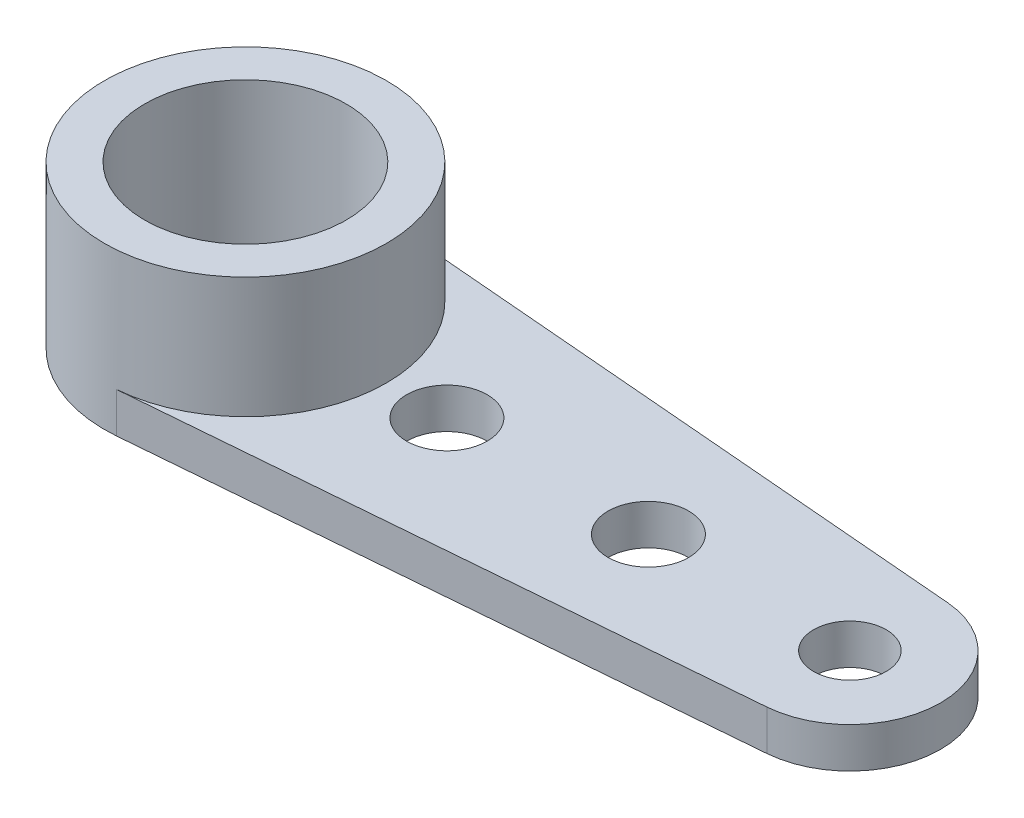
ISO-10303-21;
HEADER;
FILE_DESCRIPTION(('STEP AP214'),'2;1');
FILE_NAME('part.step','',(''),(''),'','','');
FILE_SCHEMA(('AUTOMOTIVE_DESIGN { 1 0 10303 214 1 1 1 1 }'));
ENDSEC;
DATA;
#1=APPLICATION_CONTEXT('core data for automotive mechanical design processes');
#2=APPLICATION_PROTOCOL_DEFINITION('international standard','automotive_design',2000,#1);
#3=PRODUCT_CONTEXT('',#1,'mechanical');
#4=PRODUCT('Part','Part','',(#3));
#5=PRODUCT_RELATED_PRODUCT_CATEGORY('part','',(#4));
#6=PRODUCT_DEFINITION_FORMATION('','',#4);
#7=PRODUCT_DEFINITION_CONTEXT('part definition',#1,'design');
#8=PRODUCT_DEFINITION('design','',#6,#7);
#9=PRODUCT_DEFINITION_SHAPE('','',#8);
#10=(LENGTH_UNIT() NAMED_UNIT(*) SI_UNIT(.MILLI.,.METRE.));
#11=(NAMED_UNIT(*) PLANE_ANGLE_UNIT() SI_UNIT($,.RADIAN.));
#12=(NAMED_UNIT(*) SI_UNIT($,.STERADIAN.) SOLID_ANGLE_UNIT());
#13=UNCERTAINTY_MEASURE_WITH_UNIT(LENGTH_MEASURE(1.E-05),#10,'distance_accuracy_value','');
#14=(GEOMETRIC_REPRESENTATION_CONTEXT(3) GLOBAL_UNCERTAINTY_ASSIGNED_CONTEXT((#13)) GLOBAL_UNIT_ASSIGNED_CONTEXT((#10,
#11,#12)) REPRESENTATION_CONTEXT('',''));
#15=CARTESIAN_POINT('',(0.,0.,0.));
#16=DIRECTION('',(0.,0.,1.));
#17=DIRECTION('',(1.,0.,0.));
#18=AXIS2_PLACEMENT_3D('',#15,#16,#17);
#19=CARTESIAN_POINT('',(0.291666666666666,1.,3.48782605007124));
#20=DIRECTION('',(-0.0833333333333333,0.,-0.996521728591783));
#21=DIRECTION('',(-0.996521728591783,0.,0.0833333333333333));
#22=AXIS2_PLACEMENT_3D('',#19,#20,#21);
#23=PLANE('',#22);
#24=DIRECTION('',(0.996521728591783,0.,-0.0833333333333333));
#25=VECTOR('',#24,1.);
#26=CARTESIAN_POINT('',(0.291666666666666,0.,3.48782605007124));
#27=LINE('',#26,#25);
#28=CARTESIAN_POINT('',(0.291666666666667,0.,3.48782605007124));
#29=VERTEX_POINT('',#28);
#30=CARTESIAN_POINT('',(15.1875,0.,2.24217388933151));
#31=VERTEX_POINT('',#30);
#32=EDGE_CURVE('E109',#29,#31,#27,.T.);
#33=ORIENTED_EDGE('',*,*,#32,.T.);
#34=DIRECTION('',(0.,-1.,0.));
#35=VECTOR('',#34,1.);
#36=CARTESIAN_POINT('',(15.1875,1.,2.24217388933151));
#37=LINE('',#36,#35);
#38=CARTESIAN_POINT('',(15.1875,1.,2.24217388933151));
#39=VERTEX_POINT('',#38);
#40=EDGE_CURVE('E11',#39,#31,#37,.T.);
#41=ORIENTED_EDGE('',*,*,#40,.F.);
#42=DIRECTION('',(0.996521728591783,0.,-0.0833333333333333));
#43=VECTOR('',#42,1.);
#44=CARTESIAN_POINT('',(0.291666666666666,1.,3.48782605007124));
#45=LINE('',#44,#43);
#46=CARTESIAN_POINT('',(0.291666666666667,1.,3.48782605007124));
#47=VERTEX_POINT('',#46);
#48=EDGE_CURVE('E92',#47,#39,#45,.T.);
#49=ORIENTED_EDGE('',*,*,#48,.F.);
#50=DIRECTION('',(0.,-1.,0.));
#51=VECTOR('',#50,1.);
#52=CARTESIAN_POINT('',(0.291666666666667,1.,3.48782605007124));
#53=LINE('',#52,#51);
#54=EDGE_CURVE('E94',#47,#29,#53,.T.);
#55=ORIENTED_EDGE('',*,*,#54,.T.);
#56=EDGE_LOOP('',(#33,#41,#49,#55));
#57=FACE_BOUND('',#56,.T.);
#58=ADVANCED_FACE('F46',(#57),#23,.F.);
#59=CARTESIAN_POINT('',(15.,1.,0.));
#60=DIRECTION('',(0.,-1.,0.));
#61=DIRECTION('',(0.,0.,-1.));
#62=AXIS2_PLACEMENT_3D('',#59,#60,#61);
#63=CYLINDRICAL_SURFACE('',#62,2.25);
#64=CARTESIAN_POINT('',(15.,0.,0.));
#65=DIRECTION('',(0.,1.,0.));
#66=DIRECTION('',(0.,0.,1.));
#67=AXIS2_PLACEMENT_3D('',#64,#65,#66);
#68=CIRCLE('',#67,2.25);
#69=CARTESIAN_POINT('',(15.1875,0.,-2.24217388933151));
#70=VERTEX_POINT('',#69);
#71=EDGE_CURVE('E119',#31,#70,#68,.T.);
#72=ORIENTED_EDGE('',*,*,#71,.T.);
#73=DIRECTION('',(0.,-1.,0.));
#74=VECTOR('',#73,1.);
#75=CARTESIAN_POINT('',(15.1875,1.,-2.24217388933151));
#76=LINE('',#75,#74);
#77=CARTESIAN_POINT('',(15.1875,1.,-2.24217388933151));
#78=VERTEX_POINT('',#77);
#79=EDGE_CURVE('E54',#78,#70,#76,.T.);
#80=ORIENTED_EDGE('',*,*,#79,.F.);
#81=CARTESIAN_POINT('',(15.,1.,0.));
#82=DIRECTION('',(0.,1.,0.));
#83=DIRECTION('',(0.,0.,1.));
#84=AXIS2_PLACEMENT_3D('',#81,#82,#83);
#85=CIRCLE('',#84,2.25);
#86=EDGE_CURVE('E86',#39,#78,#85,.T.);
#87=ORIENTED_EDGE('',*,*,#86,.F.);
#88=ORIENTED_EDGE('',*,*,#40,.T.);
#89=EDGE_LOOP('',(#72,#80,#87,#88));
#90=FACE_BOUND('',#89,.T.);
#91=ADVANCED_FACE('F127',(#90),#63,.T.);
#92=CARTESIAN_POINT('',(0.291666666666667,1.,-3.48782605007124));
#93=DIRECTION('',(0.0833333333333333,0.,-0.996521728591783));
#94=DIRECTION('',(-0.996521728591783,0.,-0.0833333333333333));
#95=AXIS2_PLACEMENT_3D('',#92,#93,#94);
#96=PLANE('',#95);
#97=DIRECTION('',(0.996521728591783,0.,0.0833333333333333));
#98=VECTOR('',#97,1.);
#99=CARTESIAN_POINT('',(0.291666666666667,0.,-3.48782605007124));
#100=LINE('',#99,#98);
#101=CARTESIAN_POINT('',(0.291666666666667,0.,-3.48782605007124));
#102=VERTEX_POINT('',#101);
#103=EDGE_CURVE('E122',#102,#70,#100,.T.);
#104=ORIENTED_EDGE('',*,*,#103,.F.);
#105=DIRECTION('',(0.,-1.,0.));
#106=VECTOR('',#105,1.);
#107=CARTESIAN_POINT('',(0.291666666666667,1.,-3.48782605007124));
#108=LINE('',#107,#106);
#109=CARTESIAN_POINT('',(0.291666666666667,1.,-3.48782605007124));
#110=VERTEX_POINT('',#109);
#111=EDGE_CURVE('E62',#110,#102,#108,.T.);
#112=ORIENTED_EDGE('',*,*,#111,.F.);
#113=DIRECTION('',(0.996521728591783,0.,0.0833333333333333));
#114=VECTOR('',#113,1.);
#115=CARTESIAN_POINT('',(0.291666666666667,1.,-3.48782605007124));
#116=LINE('',#115,#114);
#117=EDGE_CURVE('E102',#110,#78,#116,.T.);
#118=ORIENTED_EDGE('',*,*,#117,.T.);
#119=ORIENTED_EDGE('',*,*,#79,.T.);
#120=EDGE_LOOP('',(#104,#112,#118,#119));
#121=FACE_BOUND('',#120,.T.);
#122=ADVANCED_FACE('F126',(#121),#96,.T.);
#123=CARTESIAN_POINT('',(0.,1.,0.));
#124=DIRECTION('',(0.,-1.,0.));
#125=DIRECTION('',(0.,0.,-1.));
#126=AXIS2_PLACEMENT_3D('',#123,#124,#125);
#127=CYLINDRICAL_SURFACE('',#126,3.5);
#128=CARTESIAN_POINT('',(0.,0.,0.));
#129=DIRECTION('',(0.,1.,0.));
#130=DIRECTION('',(0.,0.,1.));
#131=AXIS2_PLACEMENT_3D('',#128,#129,#130);
#132=CIRCLE('',#131,3.5);
#133=EDGE_CURVE('E81',#102,#29,#132,.T.);
#134=ORIENTED_EDGE('',*,*,#133,.T.);
#135=ORIENTED_EDGE('',*,*,#54,.F.);
#136=CARTESIAN_POINT('',(0.,1.,0.));
#137=DIRECTION('',(0.,1.,0.));
#138=DIRECTION('',(0.,0.,1.));
#139=AXIS2_PLACEMENT_3D('',#136,#137,#138);
#140=CIRCLE('',#139,3.5);
#141=EDGE_CURVE('E101',#47,#110,#140,.T.);
#142=ORIENTED_EDGE('',*,*,#141,.T.);
#143=ORIENTED_EDGE('',*,*,#111,.T.);
#144=EDGE_LOOP('',(#134,#135,#142,#143));
#145=FACE_BOUND('',#144,.T.);
#146=CARTESIAN_POINT('',(0.,4.,0.));
#147=DIRECTION('',(0.,1.,0.));
#148=DIRECTION('',(0.,0.,1.));
#149=AXIS2_PLACEMENT_3D('',#146,#147,#148);
#150=CIRCLE('',#149,3.5);
#151=CARTESIAN_POINT('',(0.,4.,3.5));
#152=VERTEX_POINT('',#151);
#153=EDGE_CURVE('E105',#152,#152,#150,.T.);
#154=ORIENTED_EDGE('',*,*,#153,.F.);
#155=EDGE_LOOP('',(#154));
#156=FACE_BOUND('',#155,.T.);
#157=ADVANCED_FACE('F99',(#145,#156),#127,.T.);
#158=CARTESIAN_POINT('',(0.,1.,0.));
#159=DIRECTION('',(0.,1.,0.));
#160=DIRECTION('',(0.,0.,1.));
#161=AXIS2_PLACEMENT_3D('',#158,#159,#160);
#162=PLANE('',#161);
#163=CARTESIAN_POINT('',(5.,1.,0.));
#164=DIRECTION('',(0.,1.,0.));
#165=DIRECTION('',(0.,0.,1.));
#166=AXIS2_PLACEMENT_3D('',#163,#164,#165);
#167=CIRCLE('',#166,1.);
#168=CARTESIAN_POINT('',(5.,1.,1.));
#169=VERTEX_POINT('',#168);
#170=EDGE_CURVE('E226',#169,#169,#167,.T.);
#171=ORIENTED_EDGE('',*,*,#170,.F.);
#172=EDGE_LOOP('',(#171));
#173=FACE_BOUND('',#172,.T.);
#174=CARTESIAN_POINT('',(10.,1.,0.));
#175=DIRECTION('',(0.,1.,0.));
#176=DIRECTION('',(0.,0.,1.));
#177=AXIS2_PLACEMENT_3D('',#174,#175,#176);
#178=CIRCLE('',#177,1.);
#179=CARTESIAN_POINT('',(10.,1.,1.));
#180=VERTEX_POINT('',#179);
#181=EDGE_CURVE('E229',#180,#180,#178,.T.);
#182=ORIENTED_EDGE('',*,*,#181,.F.);
#183=EDGE_LOOP('',(#182));
#184=FACE_BOUND('',#183,.T.);
#185=CARTESIAN_POINT('',(15.,1.,0.));
#186=DIRECTION('',(0.,1.,0.));
#187=DIRECTION('',(0.,0.,1.));
#188=AXIS2_PLACEMENT_3D('',#185,#186,#187);
#189=CIRCLE('',#188,0.9);
#190=CARTESIAN_POINT('',(15.,1.,0.9));
#191=VERTEX_POINT('',#190);
#192=EDGE_CURVE('E241',#191,#191,#189,.T.);
#193=ORIENTED_EDGE('',*,*,#192,.F.);
#194=EDGE_LOOP('',(#193));
#195=FACE_BOUND('',#194,.T.);
#196=ORIENTED_EDGE('',*,*,#141,.F.);
#197=ORIENTED_EDGE('',*,*,#48,.T.);
#198=ORIENTED_EDGE('',*,*,#86,.T.);
#199=ORIENTED_EDGE('',*,*,#117,.F.);
#200=EDGE_LOOP('',(#196,#197,#198,#199));
#201=FACE_BOUND('',#200,.T.);
#202=ADVANCED_FACE('F104',(#173,#184,#195,#201),#162,.T.);
#203=CARTESIAN_POINT('',(0.,0.,0.));
#204=DIRECTION('',(0.,1.,0.));
#205=DIRECTION('',(0.,0.,1.));
#206=AXIS2_PLACEMENT_3D('',#203,#204,#205);
#207=PLANE('',#206);
#208=CARTESIAN_POINT('',(5.,0.,0.));
#209=DIRECTION('',(0.,-1.,0.));
#210=DIRECTION('',(0.,0.,-1.));
#211=AXIS2_PLACEMENT_3D('',#208,#209,#210);
#212=CIRCLE('',#211,1.);
#213=CARTESIAN_POINT('',(5.,0.,-1.));
#214=VERTEX_POINT('',#213);
#215=EDGE_CURVE('E228',#214,#214,#212,.T.);
#216=ORIENTED_EDGE('',*,*,#215,.F.);
#217=EDGE_LOOP('',(#216));
#218=FACE_BOUND('',#217,.T.);
#219=CARTESIAN_POINT('',(10.,0.,0.));
#220=DIRECTION('',(0.,-1.,0.));
#221=DIRECTION('',(0.,0.,-1.));
#222=AXIS2_PLACEMENT_3D('',#219,#220,#221);
#223=CIRCLE('',#222,1.);
#224=CARTESIAN_POINT('',(10.,0.,-1.));
#225=VERTEX_POINT('',#224);
#226=EDGE_CURVE('E230',#225,#225,#223,.T.);
#227=ORIENTED_EDGE('',*,*,#226,.F.);
#228=EDGE_LOOP('',(#227));
#229=FACE_BOUND('',#228,.T.);
#230=CARTESIAN_POINT('',(15.,0.,0.));
#231=DIRECTION('',(0.,-1.,0.));
#232=DIRECTION('',(0.,0.,-1.));
#233=AXIS2_PLACEMENT_3D('',#230,#231,#232);
#234=CIRCLE('',#233,0.9);
#235=CARTESIAN_POINT('',(15.,0.,-0.9));
#236=VERTEX_POINT('',#235);
#237=EDGE_CURVE('E238',#236,#236,#234,.T.);
#238=ORIENTED_EDGE('',*,*,#237,.F.);
#239=EDGE_LOOP('',(#238));
#240=FACE_BOUND('',#239,.T.);
#241=CARTESIAN_POINT('',(0.,0.,0.));
#242=DIRECTION('',(0.,1.,0.));
#243=DIRECTION('',(0.,0.,1.));
#244=AXIS2_PLACEMENT_3D('',#241,#242,#243);
#245=CIRCLE('',#244,2.5);
#246=CARTESIAN_POINT('',(0.,0.,2.5));
#247=VERTEX_POINT('',#246);
#248=EDGE_CURVE('E106',#247,#247,#245,.T.);
#249=ORIENTED_EDGE('',*,*,#248,.T.);
#250=EDGE_LOOP('',(#249));
#251=FACE_BOUND('',#250,.T.);
#252=ORIENTED_EDGE('',*,*,#32,.F.);
#253=ORIENTED_EDGE('',*,*,#133,.F.);
#254=ORIENTED_EDGE('',*,*,#103,.T.);
#255=ORIENTED_EDGE('',*,*,#71,.F.);
#256=EDGE_LOOP('',(#252,#253,#254,#255));
#257=FACE_BOUND('',#256,.T.);
#258=ADVANCED_FACE('F129',(#218,#229,#240,#251,#257),#207,.F.);
#259=CARTESIAN_POINT('',(0.,4.,0.));
#260=DIRECTION('',(0.,1.,0.));
#261=DIRECTION('',(0.,0.,1.));
#262=AXIS2_PLACEMENT_3D('',#259,#260,#261);
#263=PLANE('',#262);
#264=CARTESIAN_POINT('',(0.,4.,0.));
#265=DIRECTION('',(0.,1.,0.));
#266=DIRECTION('',(0.,0.,1.));
#267=AXIS2_PLACEMENT_3D('',#264,#265,#266);
#268=CIRCLE('',#267,2.5);
#269=CARTESIAN_POINT('',(0.,4.,2.5));
#270=VERTEX_POINT('',#269);
#271=EDGE_CURVE('E112',#270,#270,#268,.T.);
#272=ORIENTED_EDGE('',*,*,#271,.F.);
#273=EDGE_LOOP('',(#272));
#274=FACE_BOUND('',#273,.T.);
#275=ORIENTED_EDGE('',*,*,#153,.T.);
#276=EDGE_LOOP('',(#275));
#277=FACE_BOUND('',#276,.T.);
#278=ADVANCED_FACE('F131',(#274,#277),#263,.T.);
#279=CARTESIAN_POINT('',(0.,0.,0.));
#280=DIRECTION('',(0.,1.,0.));
#281=DIRECTION('',(0.,0.,1.));
#282=AXIS2_PLACEMENT_3D('',#279,#280,#281);
#283=CYLINDRICAL_SURFACE('',#282,2.5);
#284=ORIENTED_EDGE('',*,*,#248,.F.);
#285=EDGE_LOOP('',(#284));
#286=FACE_BOUND('',#285,.T.);
#287=ORIENTED_EDGE('',*,*,#271,.T.);
#288=EDGE_LOOP('',(#287));
#289=FACE_BOUND('',#288,.T.);
#290=ADVANCED_FACE('F139',(#286,#289),#283,.F.);
#291=CARTESIAN_POINT('',(15.,4.,0.));
#292=DIRECTION('',(0.,-1.,0.));
#293=DIRECTION('',(0.,0.,-1.));
#294=AXIS2_PLACEMENT_3D('',#291,#292,#293);
#295=CYLINDRICAL_SURFACE('',#294,0.9);
#296=ORIENTED_EDGE('',*,*,#192,.T.);
#297=EDGE_LOOP('',(#296));
#298=FACE_BOUND('',#297,.T.);
#299=ORIENTED_EDGE('',*,*,#237,.T.);
#300=EDGE_LOOP('',(#299));
#301=FACE_BOUND('',#300,.T.);
#302=ADVANCED_FACE('F171',(#298,#301),#295,.F.);
#303=CARTESIAN_POINT('',(10.,4.,0.));
#304=DIRECTION('',(0.,-1.,0.));
#305=DIRECTION('',(0.,0.,-1.));
#306=AXIS2_PLACEMENT_3D('',#303,#304,#305);
#307=CYLINDRICAL_SURFACE('',#306,1.);
#308=ORIENTED_EDGE('',*,*,#181,.T.);
#309=EDGE_LOOP('',(#308));
#310=FACE_BOUND('',#309,.T.);
#311=ORIENTED_EDGE('',*,*,#226,.T.);
#312=EDGE_LOOP('',(#311));
#313=FACE_BOUND('',#312,.T.);
#314=ADVANCED_FACE('F178',(#310,#313),#307,.F.);
#315=CARTESIAN_POINT('',(5.,4.,0.));
#316=DIRECTION('',(0.,-1.,0.));
#317=DIRECTION('',(0.,0.,-1.));
#318=AXIS2_PLACEMENT_3D('',#315,#316,#317);
#319=CYLINDRICAL_SURFACE('',#318,1.);
#320=ORIENTED_EDGE('',*,*,#170,.T.);
#321=EDGE_LOOP('',(#320));
#322=FACE_BOUND('',#321,.T.);
#323=ORIENTED_EDGE('',*,*,#215,.T.);
#324=EDGE_LOOP('',(#323));
#325=FACE_BOUND('',#324,.T.);
#326=ADVANCED_FACE('F213',(#322,#325),#319,.F.);
#327=CLOSED_SHELL('',(#58,#91,#122,#157,#202,#258,#278,#290,#302,#314,#326));
#328=MANIFOLD_SOLID_BREP('B2',#327);
#329=ADVANCED_BREP_SHAPE_REPRESENTATION('',(#18,#328),#14);
#330=SHAPE_DEFINITION_REPRESENTATION(#9,#329);
ENDSEC;
END-ISO-10303-21;
